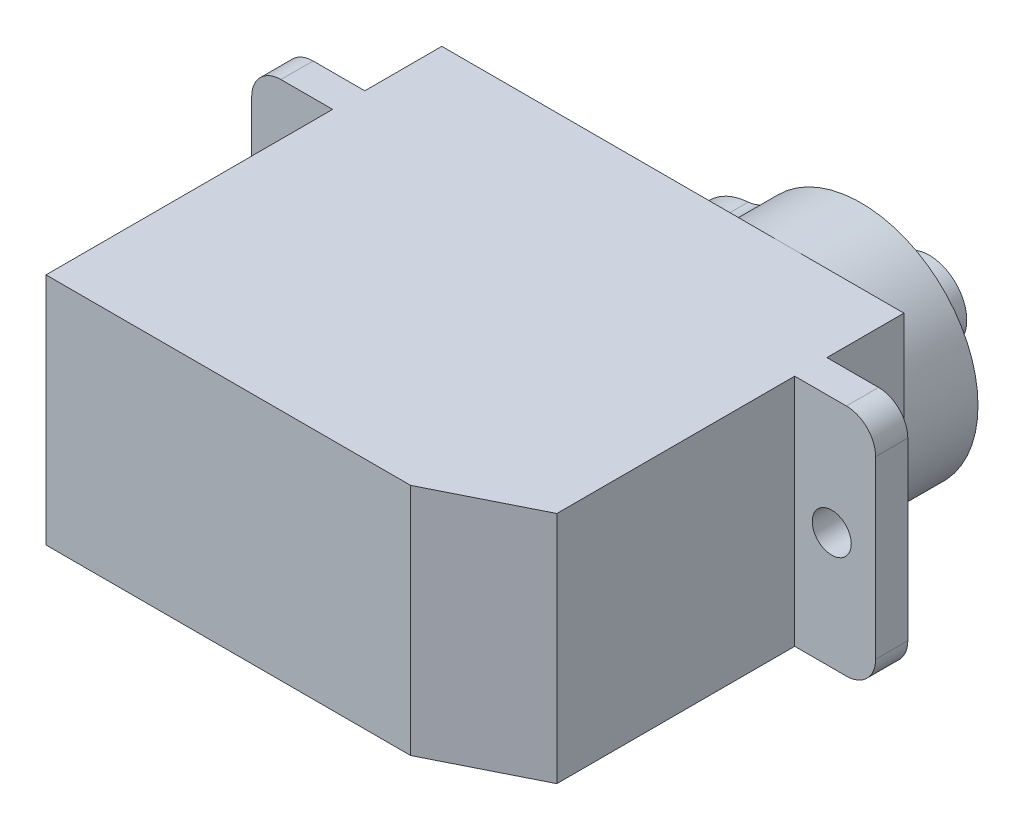
ISO-10303-21;
HEADER;
FILE_DESCRIPTION(('STEP AP214'),'2;1');
FILE_NAME('part.step','',(''),(''),'','','');
FILE_SCHEMA(('AUTOMOTIVE_DESIGN { 1 0 10303 214 1 1 1 1 }'));
ENDSEC;
DATA;
#1=APPLICATION_CONTEXT('core data for automotive mechanical design processes');
#2=APPLICATION_PROTOCOL_DEFINITION('international standard','automotive_design',2000,#1);
#3=PRODUCT_CONTEXT('',#1,'mechanical');
#4=PRODUCT('Part','Part','',(#3));
#5=PRODUCT_RELATED_PRODUCT_CATEGORY('part','',(#4));
#6=PRODUCT_DEFINITION_FORMATION('','',#4);
#7=PRODUCT_DEFINITION_CONTEXT('part definition',#1,'design');
#8=PRODUCT_DEFINITION('design','',#6,#7);
#9=PRODUCT_DEFINITION_SHAPE('','',#8);
#10=(LENGTH_UNIT() NAMED_UNIT(*) SI_UNIT(.MILLI.,.METRE.));
#11=(NAMED_UNIT(*) PLANE_ANGLE_UNIT() SI_UNIT($,.RADIAN.));
#12=(NAMED_UNIT(*) SI_UNIT($,.STERADIAN.) SOLID_ANGLE_UNIT());
#13=UNCERTAINTY_MEASURE_WITH_UNIT(LENGTH_MEASURE(1.E-05),#10,'distance_accuracy_value','');
#14=(GEOMETRIC_REPRESENTATION_CONTEXT(3) GLOBAL_UNCERTAINTY_ASSIGNED_CONTEXT((#13)) GLOBAL_UNIT_ASSIGNED_CONTEXT((#10,
#11,#12)) REPRESENTATION_CONTEXT('',''));
#15=CARTESIAN_POINT('',(0.,0.,0.));
#16=DIRECTION('',(0.,0.,1.));
#17=DIRECTION('',(1.,0.,0.));
#18=AXIS2_PLACEMENT_3D('',#15,#16,#17);
#19=CARTESIAN_POINT('',(5.85,0.,-17.45));
#20=DIRECTION('',(0.,0.,1.));
#21=DIRECTION('',(1.,0.,0.));
#22=AXIS2_PLACEMENT_3D('',#19,#20,#21);
#23=CYLINDRICAL_SURFACE('',#22,1.925);
#24=CARTESIAN_POINT('',(5.85,0.,-14.45));
#25=DIRECTION('',(0.,0.,-1.));
#26=DIRECTION('',(-1.,0.,0.));
#27=AXIS2_PLACEMENT_3D('',#24,#25,#26);
#28=CIRCLE('',#27,1.925);
#29=CARTESIAN_POINT('',(3.925,0.,-14.45));
#30=VERTEX_POINT('',#29);
#31=EDGE_CURVE('E251',#30,#30,#28,.T.);
#32=ORIENTED_EDGE('',*,*,#31,.T.);
#33=EDGE_LOOP('',(#32));
#34=FACE_BOUND('',#33,.T.);
#35=CARTESIAN_POINT('',(5.85,0.,-14.4853621479877));
#36=DIRECTION('',(0.,0.,-1.));
#37=DIRECTION('',(-1.,0.,0.));
#38=AXIS2_PLACEMENT_3D('',#35,#36,#37);
#39=CIRCLE('',#38,1.925);
#40=CARTESIAN_POINT('',(3.925,0.,-14.4853621479877));
#41=VERTEX_POINT('',#40);
#42=EDGE_CURVE('E241',#41,#41,#39,.T.);
#43=ORIENTED_EDGE('',*,*,#42,.F.);
#44=EDGE_LOOP('',(#43));
#45=FACE_BOUND('',#44,.T.);
#46=ADVANCED_FACE('F50',(#34,#45),#23,.T.);
#47=CARTESIAN_POINT('',(0.,-6.,-10.15));
#48=DIRECTION('',(0.,0.,1.));
#49=DIRECTION('',(1.,0.,0.));
#50=AXIS2_PLACEMENT_3D('',#47,#48,#49);
#51=PLANE('',#50);
#52=DIRECTION('',(-1.,0.,0.));
#53=VECTOR('',#52,1.);
#54=CARTESIAN_POINT('',(-3.85,-5.,-10.15));
#55=LINE('',#54,#53);
#56=CARTESIAN_POINT('',(-3.85,-5.,-10.15));
#57=VERTEX_POINT('',#56);
#58=CARTESIAN_POINT('',(-9.85,-5.,-10.15));
#59=VERTEX_POINT('',#58);
#60=EDGE_CURVE('E275',#57,#59,#55,.T.);
#61=ORIENTED_EDGE('',*,*,#60,.F.);
#62=DIRECTION('',(0.,-1.,0.));
#63=VECTOR('',#62,1.);
#64=CARTESIAN_POINT('',(-3.85,5.,-10.15));
#65=LINE('',#64,#63);
#66=CARTESIAN_POINT('',(-3.85,5.,-10.15));
#67=VERTEX_POINT('',#66);
#68=EDGE_CURVE('E67',#67,#57,#65,.T.);
#69=ORIENTED_EDGE('',*,*,#68,.F.);
#70=DIRECTION('',(1.,0.,0.));
#71=VECTOR('',#70,1.);
#72=CARTESIAN_POINT('',(-3.85,5.,-10.15));
#73=LINE('',#72,#71);
#74=CARTESIAN_POINT('',(-9.85,5.,-10.15));
#75=VERTEX_POINT('',#74);
#76=EDGE_CURVE('E264',#75,#67,#73,.T.);
#77=ORIENTED_EDGE('',*,*,#76,.F.);
#78=DIRECTION('',(0.,1.,0.));
#79=VECTOR('',#78,1.);
#80=CARTESIAN_POINT('',(-9.85,5.,-10.15));
#81=LINE('',#80,#79);
#82=EDGE_CURVE('E278',#59,#75,#81,.T.);
#83=ORIENTED_EDGE('',*,*,#82,.F.);
#84=EDGE_LOOP('',(#61,#69,#77,#83));
#85=FACE_BOUND('',#84,.T.);
#86=CARTESIAN_POINT('',(0.299999999999995,0.,-10.15));
#87=DIRECTION('',(0.,0.,-1.));
#88=DIRECTION('',(-1.,0.,0.));
#89=AXIS2_PLACEMENT_3D('',#86,#87,#88);
#90=CIRCLE('',#89,3.15);
#91=CARTESIAN_POINT('',(0.0665649520488194,-3.14133858066717,-10.15));
#92=VERTEX_POINT('',#91);
#93=CARTESIAN_POINT('',(0.0665649520488197,3.14133858066717,-10.15));
#94=VERTEX_POINT('',#93);
#95=EDGE_CURVE('E294',#92,#94,#90,.T.);
#96=ORIENTED_EDGE('',*,*,#95,.F.);
#97=CARTESIAN_POINT('',(-0.0445945945945973,-4.63721409527058,-10.15));
#98=DIRECTION('',(0.,0.,1.));
#99=DIRECTION('',(1.,0.,0.));
#100=AXIS2_PLACEMENT_3D('',#97,#98,#99);
#101=CIRCLE('',#100,1.5);
#102=CARTESIAN_POINT('',(1.13432432432432,-3.70977127621647,-10.15));
#103=VERTEX_POINT('',#102);
#104=EDGE_CURVE('E455',#92,#103,#101,.F.);
#105=ORIENTED_EDGE('',*,*,#104,.T.);
#106=CARTESIAN_POINT('',(5.85,0.,-10.15));
#107=DIRECTION('',(0.,0.,-1.));
#108=DIRECTION('',(-1.,0.,0.));
#109=AXIS2_PLACEMENT_3D('',#106,#107,#108);
#110=CIRCLE('',#109,6.);
#111=CARTESIAN_POINT('',(5.85,-6.,-10.15));
#112=VERTEX_POINT('',#111);
#113=EDGE_CURVE('E300',#112,#103,#110,.T.);
#114=ORIENTED_EDGE('',*,*,#113,.F.);
#115=DIRECTION('',(1.,0.,0.));
#116=VECTOR('',#115,1.);
#117=CARTESIAN_POINT('',(0.,-6.,-10.15));
#118=LINE('',#117,#116);
#119=CARTESIAN_POINT('',(-11.85,-6.,-10.15));
#120=VERTEX_POINT('',#119);
#121=EDGE_CURVE('E373',#120,#112,#118,.T.);
#122=ORIENTED_EDGE('',*,*,#121,.F.);
#123=DIRECTION('',(0.,1.,0.));
#124=VECTOR('',#123,1.);
#125=CARTESIAN_POINT('',(-11.85,-6.,-10.15));
#126=LINE('',#125,#124);
#127=CARTESIAN_POINT('',(-11.85,6.,-10.15));
#128=VERTEX_POINT('',#127);
#129=EDGE_CURVE('E377',#120,#128,#126,.T.);
#130=ORIENTED_EDGE('',*,*,#129,.T.);
#131=DIRECTION('',(1.,0.,0.));
#132=VECTOR('',#131,1.);
#133=CARTESIAN_POINT('',(0.,6.,-10.15));
#134=LINE('',#133,#132);
#135=CARTESIAN_POINT('',(5.85,6.,-10.15));
#136=VERTEX_POINT('',#135);
#137=EDGE_CURVE('E341',#128,#136,#134,.T.);
#138=ORIENTED_EDGE('',*,*,#137,.T.);
#139=CARTESIAN_POINT('',(1.13432432432432,3.70977127621647,-10.15));
#140=VERTEX_POINT('',#139);
#141=EDGE_CURVE('E285',#140,#136,#110,.T.);
#142=ORIENTED_EDGE('',*,*,#141,.F.);
#143=CARTESIAN_POINT('',(-0.0445945945945969,4.63721409527059,-10.15));
#144=DIRECTION('',(0.,0.,1.));
#145=DIRECTION('',(1.,0.,0.));
#146=AXIS2_PLACEMENT_3D('',#143,#144,#145);
#147=CIRCLE('',#146,1.5);
#148=EDGE_CURVE('E453',#140,#94,#147,.F.);
#149=ORIENTED_EDGE('',*,*,#148,.T.);
#150=EDGE_LOOP('',(#96,#105,#114,#122,#130,#138,#142,#149));
#151=FACE_BOUND('',#150,.T.);
#152=ADVANCED_FACE('F476',(#85,#151),#51,.F.);
#153=CARTESIAN_POINT('',(11.85,0.,-10.15));
#154=VERTEX_POINT('',#153);
#155=EDGE_CURVE('E299',#136,#154,#110,.T.);
#156=ORIENTED_EDGE('',*,*,#155,.F.);
#157=CARTESIAN_POINT('',(11.85,6.,-10.15));
#158=VERTEX_POINT('',#157);
#159=EDGE_CURVE('E340',#136,#158,#134,.T.);
#160=ORIENTED_EDGE('',*,*,#159,.T.);
#161=DIRECTION('',(0.,1.,0.));
#162=VECTOR('',#161,1.);
#163=CARTESIAN_POINT('',(11.85,-6.,-10.15));
#164=LINE('',#163,#162);
#165=EDGE_CURVE('E383',#154,#158,#164,.T.);
#166=ORIENTED_EDGE('',*,*,#165,.F.);
#167=EDGE_LOOP('',(#156,#160,#166));
#168=FACE_BOUND('',#167,.T.);
#169=ADVANCED_FACE('F491',(#168),#51,.F.);
#170=CARTESIAN_POINT('',(-11.85,-6.,0.));
#171=DIRECTION('',(1.,0.,0.));
#172=DIRECTION('',(0.,0.,-1.));
#173=AXIS2_PLACEMENT_3D('',#170,#171,#172);
#174=PLANE('',#173);
#175=DIRECTION('',(0.,1.,0.));
#176=VECTOR('',#175,1.);
#177=CARTESIAN_POINT('',(-11.85,-6.,-6.2));
#178=LINE('',#177,#176);
#179=CARTESIAN_POINT('',(-11.85,-6.,-6.2));
#180=VERTEX_POINT('',#179);
#181=CARTESIAN_POINT('',(-11.85,6.,-6.2));
#182=VERTEX_POINT('',#181);
#183=EDGE_CURVE('E376',#180,#182,#178,.T.);
#184=ORIENTED_EDGE('',*,*,#183,.T.);
#185=DIRECTION('',(0.,0.,-1.));
#186=VECTOR('',#185,1.);
#187=CARTESIAN_POINT('',(-11.85,6.,0.));
#188=LINE('',#187,#186);
#189=EDGE_CURVE('E312',#182,#128,#188,.T.);
#190=ORIENTED_EDGE('',*,*,#189,.T.);
#191=ORIENTED_EDGE('',*,*,#129,.F.);
#192=DIRECTION('',(0.,0.,-1.));
#193=VECTOR('',#192,1.);
#194=CARTESIAN_POINT('',(-11.85,-6.,0.));
#195=LINE('',#194,#193);
#196=EDGE_CURVE('E344',#180,#120,#195,.T.);
#197=ORIENTED_EDGE('',*,*,#196,.F.);
#198=EDGE_LOOP('',(#184,#190,#191,#197));
#199=FACE_BOUND('',#198,.T.);
#200=ADVANCED_FACE('F501',(#199),#174,.F.);
#201=EDGE_CURVE('E485',#154,#112,#110,.T.);
#202=ORIENTED_EDGE('',*,*,#201,.F.);
#203=CARTESIAN_POINT('',(11.85,-6.,-10.15));
#204=VERTEX_POINT('',#203);
#205=EDGE_CURVE('E380',#204,#154,#164,.T.);
#206=ORIENTED_EDGE('',*,*,#205,.F.);
#207=EDGE_CURVE('E372',#112,#204,#118,.T.);
#208=ORIENTED_EDGE('',*,*,#207,.F.);
#209=EDGE_LOOP('',(#202,#206,#208));
#210=FACE_BOUND('',#209,.T.);
#211=ADVANCED_FACE('F568',(#210),#51,.F.);
#212=CARTESIAN_POINT('',(11.85,-6.,0.));
#213=DIRECTION('',(1.,0.,0.));
#214=DIRECTION('',(0.,0.,-1.));
#215=AXIS2_PLACEMENT_3D('',#212,#213,#214);
#216=PLANE('',#215);
#217=ORIENTED_EDGE('',*,*,#205,.T.);
#218=ORIENTED_EDGE('',*,*,#165,.T.);
#219=DIRECTION('',(0.,0.,-1.));
#220=VECTOR('',#219,1.);
#221=CARTESIAN_POINT('',(11.85,6.,0.));
#222=LINE('',#221,#220);
#223=CARTESIAN_POINT('',(11.85,6.,-6.2));
#224=VERTEX_POINT('',#223);
#225=EDGE_CURVE('E337',#224,#158,#222,.T.);
#226=ORIENTED_EDGE('',*,*,#225,.F.);
#227=DIRECTION('',(0.,1.,0.));
#228=VECTOR('',#227,1.);
#229=CARTESIAN_POINT('',(11.85,-6.,-6.2));
#230=LINE('',#229,#228);
#231=CARTESIAN_POINT('',(11.85,-6.,-6.2));
#232=VERTEX_POINT('',#231);
#233=EDGE_CURVE('E384',#232,#224,#230,.T.);
#234=ORIENTED_EDGE('',*,*,#233,.F.);
#235=DIRECTION('',(0.,0.,-1.));
#236=VECTOR('',#235,1.);
#237=CARTESIAN_POINT('',(11.85,-6.,0.));
#238=LINE('',#237,#236);
#239=EDGE_CURVE('E369',#232,#204,#238,.T.);
#240=ORIENTED_EDGE('',*,*,#239,.T.);
#241=EDGE_LOOP('',(#217,#218,#226,#234,#240));
#242=FACE_BOUND('',#241,.T.);
#243=ADVANCED_FACE('F566',(#242),#216,.T.);
#244=CARTESIAN_POINT('',(0.,-6.,-6.2));
#245=DIRECTION('',(0.,0.,1.));
#246=DIRECTION('',(1.,0.,0.));
#247=AXIS2_PLACEMENT_3D('',#244,#245,#246);
#248=PLANE('',#247);
#249=CARTESIAN_POINT('',(13.75,0.,-6.2));
#250=DIRECTION('',(0.,0.,-1.));
#251=DIRECTION('',(-1.,0.,0.));
#252=AXIS2_PLACEMENT_3D('',#249,#250,#251);
#253=CIRCLE('',#252,1.);
#254=CARTESIAN_POINT('',(12.75,0.,-6.2));
#255=VERTEX_POINT('',#254);
#256=EDGE_CURVE('E308',#255,#255,#253,.T.);
#257=ORIENTED_EDGE('',*,*,#256,.F.);
#258=EDGE_LOOP('',(#257));
#259=FACE_BOUND('',#258,.T.);
#260=DIRECTION('',(0.,1.,0.));
#261=VECTOR('',#260,1.);
#262=CARTESIAN_POINT('',(16.,-6.,-6.2));
#263=LINE('',#262,#261);
#264=CARTESIAN_POINT('',(16.,-4.5,-6.2));
#265=VERTEX_POINT('',#264);
#266=CARTESIAN_POINT('',(16.,4.5,-6.2));
#267=VERTEX_POINT('',#266);
#268=EDGE_CURVE('E386',#265,#267,#263,.T.);
#269=ORIENTED_EDGE('',*,*,#268,.F.);
#270=CARTESIAN_POINT('',(14.5,-4.5,-6.2));
#271=DIRECTION('',(0.,0.,1.));
#272=DIRECTION('',(1.,0.,0.));
#273=AXIS2_PLACEMENT_3D('',#270,#271,#272);
#274=CIRCLE('',#273,1.5);
#275=CARTESIAN_POINT('',(14.5,-6.,-6.2));
#276=VERTEX_POINT('',#275);
#277=EDGE_CURVE('E426',#265,#276,#274,.F.);
#278=ORIENTED_EDGE('',*,*,#277,.T.);
#279=DIRECTION('',(1.,0.,0.));
#280=VECTOR('',#279,1.);
#281=CARTESIAN_POINT('',(0.,-6.,-6.2));
#282=LINE('',#281,#280);
#283=EDGE_CURVE('E366',#232,#276,#282,.T.);
#284=ORIENTED_EDGE('',*,*,#283,.F.);
#285=ORIENTED_EDGE('',*,*,#233,.T.);
#286=DIRECTION('',(1.,0.,0.));
#287=VECTOR('',#286,1.);
#288=CARTESIAN_POINT('',(0.,6.,-6.2));
#289=LINE('',#288,#287);
#290=CARTESIAN_POINT('',(14.5,6.,-6.2));
#291=VERTEX_POINT('',#290);
#292=EDGE_CURVE('E334',#224,#291,#289,.T.);
#293=ORIENTED_EDGE('',*,*,#292,.T.);
#294=CARTESIAN_POINT('',(14.5,4.5,-6.2));
#295=DIRECTION('',(0.,0.,1.));
#296=DIRECTION('',(1.,0.,0.));
#297=AXIS2_PLACEMENT_3D('',#294,#295,#296);
#298=CIRCLE('',#297,1.5);
#299=EDGE_CURVE('E424',#291,#267,#298,.F.);
#300=ORIENTED_EDGE('',*,*,#299,.T.);
#301=EDGE_LOOP('',(#269,#278,#284,#285,#293,#300));
#302=FACE_BOUND('',#301,.T.);
#303=ADVANCED_FACE('F555',(#259,#302),#248,.F.);
#304=CARTESIAN_POINT('',(16.,-6.,0.));
#305=DIRECTION('',(-1.,0.,0.));
#306=DIRECTION('',(0.,0.,1.));
#307=AXIS2_PLACEMENT_3D('',#304,#305,#306);
#308=PLANE('',#307);
#309=DIRECTION('',(0.,1.,0.));
#310=VECTOR('',#309,1.);
#311=CARTESIAN_POINT('',(16.,-6.,-4.55));
#312=LINE('',#311,#310);
#313=CARTESIAN_POINT('',(16.,-4.5,-4.55));
#314=VERTEX_POINT('',#313);
#315=CARTESIAN_POINT('',(16.,4.5,-4.55));
#316=VERTEX_POINT('',#315);
#317=EDGE_CURVE('E389',#314,#316,#312,.T.);
#318=ORIENTED_EDGE('',*,*,#317,.F.);
#319=DIRECTION('',(0.,0.,1.));
#320=VECTOR('',#319,1.);
#321=CARTESIAN_POINT('',(16.,-4.5,0.));
#322=LINE('',#321,#320);
#323=EDGE_CURVE('E422',#314,#265,#322,.F.);
#324=ORIENTED_EDGE('',*,*,#323,.T.);
#325=ORIENTED_EDGE('',*,*,#268,.T.);
#326=DIRECTION('',(0.,0.,1.));
#327=VECTOR('',#326,1.);
#328=CARTESIAN_POINT('',(16.,4.5,-4.55));
#329=LINE('',#328,#327);
#330=EDGE_CURVE('E419',#267,#316,#329,.T.);
#331=ORIENTED_EDGE('',*,*,#330,.T.);
#332=EDGE_LOOP('',(#318,#324,#325,#331));
#333=FACE_BOUND('',#332,.T.);
#334=ADVANCED_FACE('F558',(#333),#308,.F.);
#335=CARTESIAN_POINT('',(0.,-6.,-4.55));
#336=DIRECTION('',(0.,0.,1.));
#337=DIRECTION('',(1.,0.,0.));
#338=AXIS2_PLACEMENT_3D('',#335,#336,#337);
#339=PLANE('',#338);
#340=CARTESIAN_POINT('',(13.75,0.,-4.55));
#341=DIRECTION('',(0.,0.,1.));
#342=DIRECTION('',(1.,0.,0.));
#343=AXIS2_PLACEMENT_3D('',#340,#341,#342);
#344=CIRCLE('',#343,1.);
#345=CARTESIAN_POINT('',(14.75,0.,-4.55));
#346=VERTEX_POINT('',#345);
#347=EDGE_CURVE('E311',#346,#346,#344,.T.);
#348=ORIENTED_EDGE('',*,*,#347,.F.);
#349=EDGE_LOOP('',(#348));
#350=FACE_BOUND('',#349,.T.);
#351=DIRECTION('',(1.,0.,0.));
#352=VECTOR('',#351,1.);
#353=CARTESIAN_POINT('',(0.,-6.,-4.55));
#354=LINE('',#353,#352);
#355=CARTESIAN_POINT('',(11.85,-6.,-4.55));
#356=VERTEX_POINT('',#355);
#357=CARTESIAN_POINT('',(14.5,-6.,-4.55));
#358=VERTEX_POINT('',#357);
#359=EDGE_CURVE('E363',#356,#358,#354,.T.);
#360=ORIENTED_EDGE('',*,*,#359,.T.);
#361=CARTESIAN_POINT('',(14.5,-4.5,-4.55));
#362=DIRECTION('',(0.,0.,1.));
#363=DIRECTION('',(1.,0.,0.));
#364=AXIS2_PLACEMENT_3D('',#361,#362,#363);
#365=CIRCLE('',#364,1.5);
#366=EDGE_CURVE('E417',#358,#314,#365,.T.);
#367=ORIENTED_EDGE('',*,*,#366,.T.);
#368=ORIENTED_EDGE('',*,*,#317,.T.);
#369=CARTESIAN_POINT('',(14.5,4.5,-4.55));
#370=DIRECTION('',(0.,0.,1.));
#371=DIRECTION('',(1.,0.,0.));
#372=AXIS2_PLACEMENT_3D('',#369,#370,#371);
#373=CIRCLE('',#372,1.5);
#374=CARTESIAN_POINT('',(14.5,6.,-4.55));
#375=VERTEX_POINT('',#374);
#376=EDGE_CURVE('E415',#316,#375,#373,.T.);
#377=ORIENTED_EDGE('',*,*,#376,.T.);
#378=DIRECTION('',(1.,0.,0.));
#379=VECTOR('',#378,1.);
#380=CARTESIAN_POINT('',(0.,6.,-4.55));
#381=LINE('',#380,#379);
#382=CARTESIAN_POINT('',(11.85,6.,-4.55));
#383=VERTEX_POINT('',#382);
#384=EDGE_CURVE('E331',#383,#375,#381,.T.);
#385=ORIENTED_EDGE('',*,*,#384,.F.);
#386=DIRECTION('',(0.,1.,0.));
#387=VECTOR('',#386,1.);
#388=CARTESIAN_POINT('',(11.85,-6.,-4.55));
#389=LINE('',#388,#387);
#390=EDGE_CURVE('E392',#356,#383,#389,.T.);
#391=ORIENTED_EDGE('',*,*,#390,.F.);
#392=EDGE_LOOP('',(#360,#367,#368,#377,#385,#391));
#393=FACE_BOUND('',#392,.T.);
#394=ADVANCED_FACE('F545',(#350,#393),#339,.T.);
#395=CARTESIAN_POINT('',(11.85,-6.,0.));
#396=DIRECTION('',(1.,0.,0.));
#397=DIRECTION('',(0.,0.,-1.));
#398=AXIS2_PLACEMENT_3D('',#395,#396,#397);
#399=PLANE('',#398);
#400=ORIENTED_EDGE('',*,*,#390,.T.);
#401=DIRECTION('',(0.,0.,-1.));
#402=VECTOR('',#401,1.);
#403=CARTESIAN_POINT('',(11.85,6.,0.));
#404=LINE('',#403,#402);
#405=CARTESIAN_POINT('',(11.85,6.,7.65));
#406=VERTEX_POINT('',#405);
#407=EDGE_CURVE('E328',#406,#383,#404,.T.);
#408=ORIENTED_EDGE('',*,*,#407,.F.);
#409=DIRECTION('',(0.,1.,0.));
#410=VECTOR('',#409,1.);
#411=CARTESIAN_POINT('',(11.85,-6.,7.65));
#412=LINE('',#411,#410);
#413=CARTESIAN_POINT('',(11.85,-6.,7.65));
#414=VERTEX_POINT('',#413);
#415=EDGE_CURVE('E394',#414,#406,#412,.T.);
#416=ORIENTED_EDGE('',*,*,#415,.F.);
#417=DIRECTION('',(0.,0.,-1.));
#418=VECTOR('',#417,1.);
#419=CARTESIAN_POINT('',(11.85,-6.,0.));
#420=LINE('',#419,#418);
#421=EDGE_CURVE('E360',#414,#356,#420,.T.);
#422=ORIENTED_EDGE('',*,*,#421,.T.);
#423=EDGE_LOOP('',(#400,#408,#416,#422));
#424=FACE_BOUND('',#423,.T.);
#425=ADVANCED_FACE('F541',(#424),#399,.T.);
#426=CARTESIAN_POINT('',(5.43,-6.,10.86));
#427=DIRECTION('',(0.447213595499958,0.,0.894427190999916));
#428=DIRECTION('',(0.894427190999916,0.,-0.447213595499958));
#429=AXIS2_PLACEMENT_3D('',#426,#427,#428);
#430=PLANE('',#429);
#431=ORIENTED_EDGE('',*,*,#415,.T.);
#432=DIRECTION('',(0.894427190999916,0.,-0.447213595499958));
#433=VECTOR('',#432,1.);
#434=CARTESIAN_POINT('',(5.43,6.,10.86));
#435=LINE('',#434,#433);
#436=CARTESIAN_POINT('',(6.84999999999999,6.,10.15));
#437=VERTEX_POINT('',#436);
#438=EDGE_CURVE('E325',#437,#406,#435,.T.);
#439=ORIENTED_EDGE('',*,*,#438,.F.);
#440=DIRECTION('',(0.,1.,0.));
#441=VECTOR('',#440,1.);
#442=CARTESIAN_POINT('',(6.84999999999999,-6.,10.15));
#443=LINE('',#442,#441);
#444=CARTESIAN_POINT('',(6.84999999999999,-6.,10.15));
#445=VERTEX_POINT('',#444);
#446=EDGE_CURVE('E396',#445,#437,#443,.T.);
#447=ORIENTED_EDGE('',*,*,#446,.F.);
#448=DIRECTION('',(0.894427190999916,0.,-0.447213595499958));
#449=VECTOR('',#448,1.);
#450=CARTESIAN_POINT('',(5.43,-6.,10.86));
#451=LINE('',#450,#449);
#452=EDGE_CURVE('E357',#445,#414,#451,.T.);
#453=ORIENTED_EDGE('',*,*,#452,.T.);
#454=EDGE_LOOP('',(#431,#439,#447,#453));
#455=FACE_BOUND('',#454,.T.);
#456=ADVANCED_FACE('F538',(#455),#430,.T.);
#457=CARTESIAN_POINT('',(0.,-6.,10.15));
#458=DIRECTION('',(0.,0.,1.));
#459=DIRECTION('',(1.,0.,0.));
#460=AXIS2_PLACEMENT_3D('',#457,#458,#459);
#461=PLANE('',#460);
#462=ORIENTED_EDGE('',*,*,#446,.T.);
#463=DIRECTION('',(1.,0.,0.));
#464=VECTOR('',#463,1.);
#465=CARTESIAN_POINT('',(0.,6.,10.15));
#466=LINE('',#465,#464);
#467=CARTESIAN_POINT('',(-11.85,6.,10.15));
#468=VERTEX_POINT('',#467);
#469=EDGE_CURVE('E322',#468,#437,#466,.T.);
#470=ORIENTED_EDGE('',*,*,#469,.F.);
#471=DIRECTION('',(0.,1.,0.));
#472=VECTOR('',#471,1.);
#473=CARTESIAN_POINT('',(-11.85,-6.,10.15));
#474=LINE('',#473,#472);
#475=CARTESIAN_POINT('',(-11.85,-6.,10.15));
#476=VERTEX_POINT('',#475);
#477=EDGE_CURVE('E398',#476,#468,#474,.T.);
#478=ORIENTED_EDGE('',*,*,#477,.F.);
#479=DIRECTION('',(1.,0.,0.));
#480=VECTOR('',#479,1.);
#481=CARTESIAN_POINT('',(0.,-6.,10.15));
#482=LINE('',#481,#480);
#483=EDGE_CURVE('E354',#476,#445,#482,.T.);
#484=ORIENTED_EDGE('',*,*,#483,.T.);
#485=EDGE_LOOP('',(#462,#470,#478,#484));
#486=FACE_BOUND('',#485,.T.);
#487=ADVANCED_FACE('F919',(#486),#461,.T.);
#488=CARTESIAN_POINT('',(-11.85,-6.,0.));
#489=DIRECTION('',(1.,0.,0.));
#490=DIRECTION('',(0.,0.,-1.));
#491=AXIS2_PLACEMENT_3D('',#488,#489,#490);
#492=PLANE('',#491);
#493=ORIENTED_EDGE('',*,*,#477,.T.);
#494=DIRECTION('',(0.,0.,-1.));
#495=VECTOR('',#494,1.);
#496=CARTESIAN_POINT('',(-11.85,6.,0.));
#497=LINE('',#496,#495);
#498=CARTESIAN_POINT('',(-11.85,6.,-4.55));
#499=VERTEX_POINT('',#498);
#500=EDGE_CURVE('E319',#468,#499,#497,.T.);
#501=ORIENTED_EDGE('',*,*,#500,.T.);
#502=DIRECTION('',(0.,1.,0.));
#503=VECTOR('',#502,1.);
#504=CARTESIAN_POINT('',(-11.85,-6.,-4.55));
#505=LINE('',#504,#503);
#506=CARTESIAN_POINT('',(-11.85,-6.,-4.55));
#507=VERTEX_POINT('',#506);
#508=EDGE_CURVE('E400',#507,#499,#505,.T.);
#509=ORIENTED_EDGE('',*,*,#508,.F.);
#510=DIRECTION('',(0.,0.,-1.));
#511=VECTOR('',#510,1.);
#512=CARTESIAN_POINT('',(-11.85,-6.,0.));
#513=LINE('',#512,#511);
#514=EDGE_CURVE('E351',#476,#507,#513,.T.);
#515=ORIENTED_EDGE('',*,*,#514,.F.);
#516=EDGE_LOOP('',(#493,#501,#509,#515));
#517=FACE_BOUND('',#516,.T.);
#518=ADVANCED_FACE('F531',(#517),#492,.F.);
#519=CARTESIAN_POINT('',(0.,-6.,-4.55));
#520=DIRECTION('',(0.,0.,1.));
#521=DIRECTION('',(1.,0.,0.));
#522=AXIS2_PLACEMENT_3D('',#519,#520,#521);
#523=PLANE('',#522);
#524=CARTESIAN_POINT('',(-13.75,0.,-4.55));
#525=DIRECTION('',(0.,0.,1.));
#526=DIRECTION('',(1.,0.,0.));
#527=AXIS2_PLACEMENT_3D('',#524,#525,#526);
#528=CIRCLE('',#527,1.);
#529=CARTESIAN_POINT('',(-12.75,0.,-4.55));
#530=VERTEX_POINT('',#529);
#531=EDGE_CURVE('E305',#530,#530,#528,.T.);
#532=ORIENTED_EDGE('',*,*,#531,.F.);
#533=EDGE_LOOP('',(#532));
#534=FACE_BOUND('',#533,.T.);
#535=DIRECTION('',(1.,0.,0.));
#536=VECTOR('',#535,1.);
#537=CARTESIAN_POINT('',(0.,6.,-4.55));
#538=LINE('',#537,#536);
#539=CARTESIAN_POINT('',(-14.5,6.,-4.55));
#540=VERTEX_POINT('',#539);
#541=EDGE_CURVE('E317',#540,#499,#538,.T.);
#542=ORIENTED_EDGE('',*,*,#541,.F.);
#543=CARTESIAN_POINT('',(-14.5,4.5,-4.55));
#544=DIRECTION('',(0.,0.,1.));
#545=DIRECTION('',(1.,0.,0.));
#546=AXIS2_PLACEMENT_3D('',#543,#544,#545);
#547=CIRCLE('',#546,1.5);
#548=CARTESIAN_POINT('',(-16.,4.5,-4.55));
#549=VERTEX_POINT('',#548);
#550=EDGE_CURVE('E435',#540,#549,#547,.T.);
#551=ORIENTED_EDGE('',*,*,#550,.T.);
#552=DIRECTION('',(0.,1.,0.));
#553=VECTOR('',#552,1.);
#554=CARTESIAN_POINT('',(-16.,-6.,-4.55));
#555=LINE('',#554,#553);
#556=CARTESIAN_POINT('',(-16.,-4.5,-4.55));
#557=VERTEX_POINT('',#556);
#558=EDGE_CURVE('E403',#557,#549,#555,.T.);
#559=ORIENTED_EDGE('',*,*,#558,.F.);
#560=CARTESIAN_POINT('',(-14.5,-4.5,-4.55));
#561=DIRECTION('',(0.,0.,1.));
#562=DIRECTION('',(1.,0.,0.));
#563=AXIS2_PLACEMENT_3D('',#560,#561,#562);
#564=CIRCLE('',#563,1.5);
#565=CARTESIAN_POINT('',(-14.5,-6.,-4.55));
#566=VERTEX_POINT('',#565);
#567=EDGE_CURVE('E433',#557,#566,#564,.T.);
#568=ORIENTED_EDGE('',*,*,#567,.T.);
#569=DIRECTION('',(1.,0.,0.));
#570=VECTOR('',#569,1.);
#571=CARTESIAN_POINT('',(0.,-6.,-4.55));
#572=LINE('',#571,#570);
#573=EDGE_CURVE('E349',#566,#507,#572,.T.);
#574=ORIENTED_EDGE('',*,*,#573,.T.);
#575=ORIENTED_EDGE('',*,*,#508,.T.);
#576=EDGE_LOOP('',(#542,#551,#559,#568,#574,#575));
#577=FACE_BOUND('',#576,.T.);
#578=ADVANCED_FACE('F513',(#534,#577),#523,.T.);
#579=CARTESIAN_POINT('',(-16.,-6.,0.));
#580=DIRECTION('',(-1.,0.,0.));
#581=DIRECTION('',(0.,0.,1.));
#582=AXIS2_PLACEMENT_3D('',#579,#580,#581);
#583=PLANE('',#582);
#584=ORIENTED_EDGE('',*,*,#558,.T.);
#585=DIRECTION('',(0.,0.,1.));
#586=VECTOR('',#585,1.);
#587=CARTESIAN_POINT('',(-16.,4.5,0.));
#588=LINE('',#587,#586);
#589=CARTESIAN_POINT('',(-16.,4.5,-6.2));
#590=VERTEX_POINT('',#589);
#591=EDGE_CURVE('E440',#549,#590,#588,.F.);
#592=ORIENTED_EDGE('',*,*,#591,.T.);
#593=DIRECTION('',(0.,1.,0.));
#594=VECTOR('',#593,1.);
#595=CARTESIAN_POINT('',(-16.,-6.,-6.2));
#596=LINE('',#595,#594);
#597=CARTESIAN_POINT('',(-16.,-4.5,-6.2));
#598=VERTEX_POINT('',#597);
#599=EDGE_CURVE('E406',#598,#590,#596,.T.);
#600=ORIENTED_EDGE('',*,*,#599,.F.);
#601=DIRECTION('',(0.,0.,1.));
#602=VECTOR('',#601,1.);
#603=CARTESIAN_POINT('',(-16.,-4.5,-4.55));
#604=LINE('',#603,#602);
#605=EDGE_CURVE('E437',#598,#557,#604,.T.);
#606=ORIENTED_EDGE('',*,*,#605,.T.);
#607=EDGE_LOOP('',(#584,#592,#600,#606));
#608=FACE_BOUND('',#607,.T.);
#609=ADVANCED_FACE('F515',(#608),#583,.T.);
#610=CARTESIAN_POINT('',(0.,-6.,-6.2));
#611=DIRECTION('',(0.,0.,1.));
#612=DIRECTION('',(1.,0.,0.));
#613=AXIS2_PLACEMENT_3D('',#610,#611,#612);
#614=PLANE('',#613);
#615=CARTESIAN_POINT('',(-13.75,0.,-6.2));
#616=DIRECTION('',(0.,0.,-1.));
#617=DIRECTION('',(-1.,0.,0.));
#618=AXIS2_PLACEMENT_3D('',#615,#616,#617);
#619=CIRCLE('',#618,1.);
#620=CARTESIAN_POINT('',(-14.75,0.,-6.2));
#621=VERTEX_POINT('',#620);
#622=EDGE_CURVE('E297',#621,#621,#619,.T.);
#623=ORIENTED_EDGE('',*,*,#622,.F.);
#624=EDGE_LOOP('',(#623));
#625=FACE_BOUND('',#624,.T.);
#626=ORIENTED_EDGE('',*,*,#599,.T.);
#627=CARTESIAN_POINT('',(-14.5,4.5,-6.2));
#628=DIRECTION('',(0.,0.,1.));
#629=DIRECTION('',(1.,0.,0.));
#630=AXIS2_PLACEMENT_3D('',#627,#628,#629);
#631=CIRCLE('',#630,1.5);
#632=CARTESIAN_POINT('',(-14.5,6.,-6.2));
#633=VERTEX_POINT('',#632);
#634=EDGE_CURVE('E444',#590,#633,#631,.F.);
#635=ORIENTED_EDGE('',*,*,#634,.T.);
#636=DIRECTION('',(1.,0.,0.));
#637=VECTOR('',#636,1.);
#638=CARTESIAN_POINT('',(0.,6.,-6.2));
#639=LINE('',#638,#637);
#640=EDGE_CURVE('E315',#633,#182,#639,.T.);
#641=ORIENTED_EDGE('',*,*,#640,.T.);
#642=ORIENTED_EDGE('',*,*,#183,.F.);
#643=DIRECTION('',(1.,0.,0.));
#644=VECTOR('',#643,1.);
#645=CARTESIAN_POINT('',(0.,-6.,-6.2));
#646=LINE('',#645,#644);
#647=CARTESIAN_POINT('',(-14.5,-6.,-6.2));
#648=VERTEX_POINT('',#647);
#649=EDGE_CURVE('E347',#648,#180,#646,.T.);
#650=ORIENTED_EDGE('',*,*,#649,.F.);
#651=CARTESIAN_POINT('',(-14.5,-4.5,-6.2));
#652=DIRECTION('',(0.,0.,1.));
#653=DIRECTION('',(1.,0.,0.));
#654=AXIS2_PLACEMENT_3D('',#651,#652,#653);
#655=CIRCLE('',#654,1.5);
#656=EDGE_CURVE('E442',#648,#598,#655,.F.);
#657=ORIENTED_EDGE('',*,*,#656,.T.);
#658=EDGE_LOOP('',(#626,#635,#641,#642,#650,#657));
#659=FACE_BOUND('',#658,.T.);
#660=ADVANCED_FACE('F569',(#625,#659),#614,.F.);
#661=CARTESIAN_POINT('',(0.,-6.,0.));
#662=DIRECTION('',(0.,1.,0.));
#663=DIRECTION('',(0.,0.,1.));
#664=AXIS2_PLACEMENT_3D('',#661,#662,#663);
#665=PLANE('',#664);
#666=ORIENTED_EDGE('',*,*,#283,.T.);
#667=DIRECTION('',(0.,0.,1.));
#668=VECTOR('',#667,1.);
#669=CARTESIAN_POINT('',(14.5,-6.,0.));
#670=LINE('',#669,#668);
#671=EDGE_CURVE('E412',#276,#358,#670,.T.);
#672=ORIENTED_EDGE('',*,*,#671,.T.);
#673=ORIENTED_EDGE('',*,*,#359,.F.);
#674=ORIENTED_EDGE('',*,*,#421,.F.);
#675=ORIENTED_EDGE('',*,*,#452,.F.);
#676=ORIENTED_EDGE('',*,*,#483,.F.);
#677=ORIENTED_EDGE('',*,*,#514,.T.);
#678=ORIENTED_EDGE('',*,*,#573,.F.);
#679=DIRECTION('',(0.,0.,1.));
#680=VECTOR('',#679,1.);
#681=CARTESIAN_POINT('',(-14.5,-6.,-6.2));
#682=LINE('',#681,#680);
#683=EDGE_CURVE('E379',#566,#648,#682,.F.);
#684=ORIENTED_EDGE('',*,*,#683,.T.);
#685=ORIENTED_EDGE('',*,*,#649,.T.);
#686=ORIENTED_EDGE('',*,*,#196,.T.);
#687=ORIENTED_EDGE('',*,*,#121,.T.);
#688=ORIENTED_EDGE('',*,*,#207,.T.);
#689=ORIENTED_EDGE('',*,*,#239,.F.);
#690=EDGE_LOOP('',(#666,#672,#673,#674,#675,#676,#677,#678,#684,#685,#686,#687,#688,#689));
#691=FACE_BOUND('',#690,.T.);
#692=ADVANCED_FACE('F524',(#691),#665,.F.);
#693=CARTESIAN_POINT('',(0.,6.,0.));
#694=DIRECTION('',(0.,1.,0.));
#695=DIRECTION('',(0.,0.,1.));
#696=AXIS2_PLACEMENT_3D('',#693,#694,#695);
#697=PLANE('',#696);
#698=ORIENTED_EDGE('',*,*,#384,.T.);
#699=DIRECTION('',(0.,0.,1.));
#700=VECTOR('',#699,1.);
#701=CARTESIAN_POINT('',(14.5,6.,-6.2));
#702=LINE('',#701,#700);
#703=EDGE_CURVE('E431',#375,#291,#702,.F.);
#704=ORIENTED_EDGE('',*,*,#703,.T.);
#705=ORIENTED_EDGE('',*,*,#292,.F.);
#706=ORIENTED_EDGE('',*,*,#225,.T.);
#707=ORIENTED_EDGE('',*,*,#159,.F.);
#708=ORIENTED_EDGE('',*,*,#137,.F.);
#709=ORIENTED_EDGE('',*,*,#189,.F.);
#710=ORIENTED_EDGE('',*,*,#640,.F.);
#711=DIRECTION('',(0.,0.,1.));
#712=VECTOR('',#711,1.);
#713=CARTESIAN_POINT('',(-14.5,6.,0.));
#714=LINE('',#713,#712);
#715=EDGE_CURVE('E428',#633,#540,#714,.T.);
#716=ORIENTED_EDGE('',*,*,#715,.T.);
#717=ORIENTED_EDGE('',*,*,#541,.T.);
#718=ORIENTED_EDGE('',*,*,#500,.F.);
#719=ORIENTED_EDGE('',*,*,#469,.T.);
#720=ORIENTED_EDGE('',*,*,#438,.T.);
#721=ORIENTED_EDGE('',*,*,#407,.T.);
#722=EDGE_LOOP('',(#698,#704,#705,#706,#707,#708,#709,#710,#716,#717,#718,#719,#720,#721));
#723=FACE_BOUND('',#722,.T.);
#724=ADVANCED_FACE('F494',(#723),#697,.T.);
#725=CARTESIAN_POINT('',(14.5,-4.5,0.));
#726=DIRECTION('',(0.,0.,1.));
#727=DIRECTION('',(1.,0.,0.));
#728=AXIS2_PLACEMENT_3D('',#725,#726,#727);
#729=CYLINDRICAL_SURFACE('',#728,1.5);
#730=ORIENTED_EDGE('',*,*,#277,.F.);
#731=ORIENTED_EDGE('',*,*,#323,.F.);
#732=ORIENTED_EDGE('',*,*,#366,.F.);
#733=ORIENTED_EDGE('',*,*,#671,.F.);
#734=EDGE_LOOP('',(#730,#731,#732,#733));
#735=FACE_BOUND('',#734,.T.);
#736=ADVANCED_FACE('F561',(#735),#729,.T.);
#737=CARTESIAN_POINT('',(14.5,4.5,0.));
#738=DIRECTION('',(0.,0.,-1.));
#739=DIRECTION('',(-1.,0.,0.));
#740=AXIS2_PLACEMENT_3D('',#737,#738,#739);
#741=CYLINDRICAL_SURFACE('',#740,1.5);
#742=ORIENTED_EDGE('',*,*,#299,.F.);
#743=ORIENTED_EDGE('',*,*,#703,.F.);
#744=ORIENTED_EDGE('',*,*,#376,.F.);
#745=ORIENTED_EDGE('',*,*,#330,.F.);
#746=EDGE_LOOP('',(#742,#743,#744,#745));
#747=FACE_BOUND('',#746,.T.);
#748=ADVANCED_FACE('F551',(#747),#741,.T.);
#749=CARTESIAN_POINT('',(-14.5,4.5,0.));
#750=DIRECTION('',(0.,0.,1.));
#751=DIRECTION('',(1.,0.,0.));
#752=AXIS2_PLACEMENT_3D('',#749,#750,#751);
#753=CYLINDRICAL_SURFACE('',#752,1.5);
#754=ORIENTED_EDGE('',*,*,#634,.F.);
#755=ORIENTED_EDGE('',*,*,#591,.F.);
#756=ORIENTED_EDGE('',*,*,#550,.F.);
#757=ORIENTED_EDGE('',*,*,#715,.F.);
#758=EDGE_LOOP('',(#754,#755,#756,#757));
#759=FACE_BOUND('',#758,.T.);
#760=ADVANCED_FACE('F509',(#759),#753,.T.);
#761=CARTESIAN_POINT('',(-14.5,-4.5,0.));
#762=DIRECTION('',(0.,0.,-1.));
#763=DIRECTION('',(-1.,0.,0.));
#764=AXIS2_PLACEMENT_3D('',#761,#762,#763);
#765=CYLINDRICAL_SURFACE('',#764,1.5);
#766=ORIENTED_EDGE('',*,*,#656,.F.);
#767=ORIENTED_EDGE('',*,*,#683,.F.);
#768=ORIENTED_EDGE('',*,*,#567,.F.);
#769=ORIENTED_EDGE('',*,*,#605,.F.);
#770=EDGE_LOOP('',(#766,#767,#768,#769));
#771=FACE_BOUND('',#770,.T.);
#772=ADVANCED_FACE('F520',(#771),#765,.T.);
#773=CARTESIAN_POINT('',(13.75,0.,10.15));
#774=DIRECTION('',(0.,0.,-1.));
#775=DIRECTION('',(-1.,0.,0.));
#776=AXIS2_PLACEMENT_3D('',#773,#774,#775);
#777=CYLINDRICAL_SURFACE('',#776,1.);
#778=ORIENTED_EDGE('',*,*,#347,.T.);
#779=EDGE_LOOP('',(#778));
#780=FACE_BOUND('',#779,.T.);
#781=ORIENTED_EDGE('',*,*,#256,.T.);
#782=EDGE_LOOP('',(#781));
#783=FACE_BOUND('',#782,.T.);
#784=ADVANCED_FACE('F824',(#780,#783),#777,.F.);
#785=CARTESIAN_POINT('',(-13.75,0.,10.15));
#786=DIRECTION('',(0.,0.,-1.));
#787=DIRECTION('',(-1.,0.,0.));
#788=AXIS2_PLACEMENT_3D('',#785,#786,#787);
#789=CYLINDRICAL_SURFACE('',#788,1.);
#790=ORIENTED_EDGE('',*,*,#531,.T.);
#791=EDGE_LOOP('',(#790));
#792=FACE_BOUND('',#791,.T.);
#793=ORIENTED_EDGE('',*,*,#622,.T.);
#794=EDGE_LOOP('',(#793));
#795=FACE_BOUND('',#794,.T.);
#796=ADVANCED_FACE('F772',(#792,#795),#789,.F.);
#797=CARTESIAN_POINT('',(5.85,0.,-13.95));
#798=DIRECTION('',(0.,0.,1.));
#799=DIRECTION('',(1.,0.,0.));
#800=AXIS2_PLACEMENT_3D('',#797,#798,#799);
#801=CYLINDRICAL_SURFACE('',#800,6.);
#802=ORIENTED_EDGE('',*,*,#113,.T.);
#803=DIRECTION('',(0.,0.,1.));
#804=VECTOR('',#803,1.);
#805=CARTESIAN_POINT('',(1.13432432432432,-3.70977127621647,-13.95));
#806=LINE('',#805,#804);
#807=CARTESIAN_POINT('',(1.13432432432432,-3.70977127621647,-13.95));
#808=VERTEX_POINT('',#807);
#809=EDGE_CURVE('E75',#103,#808,#806,.F.);
#810=ORIENTED_EDGE('',*,*,#809,.T.);
#811=CARTESIAN_POINT('',(5.85,0.,-13.95));
#812=DIRECTION('',(0.,0.,-1.));
#813=DIRECTION('',(-1.,0.,0.));
#814=AXIS2_PLACEMENT_3D('',#811,#812,#813);
#815=CIRCLE('',#814,6.);
#816=CARTESIAN_POINT('',(1.13432432432432,3.70977127621647,-13.95));
#817=VERTEX_POINT('',#816);
#818=EDGE_CURVE('E291',#817,#808,#815,.T.);
#819=ORIENTED_EDGE('',*,*,#818,.F.);
#820=DIRECTION('',(0.,0.,1.));
#821=VECTOR('',#820,1.);
#822=CARTESIAN_POINT('',(1.13432432432432,3.70977127621647,-13.95));
#823=LINE('',#822,#821);
#824=EDGE_CURVE('E457',#817,#140,#823,.T.);
#825=ORIENTED_EDGE('',*,*,#824,.T.);
#826=ORIENTED_EDGE('',*,*,#141,.T.);
#827=ORIENTED_EDGE('',*,*,#155,.T.);
#828=ORIENTED_EDGE('',*,*,#201,.T.);
#829=EDGE_LOOP('',(#802,#810,#819,#825,#826,#827,#828));
#830=FACE_BOUND('',#829,.T.);
#831=ADVANCED_FACE('F471',(#830),#801,.T.);
#832=CARTESIAN_POINT('',(0.299999999999995,0.,-13.95));
#833=DIRECTION('',(0.,0.,1.));
#834=DIRECTION('',(1.,0.,0.));
#835=AXIS2_PLACEMENT_3D('',#832,#833,#834);
#836=CYLINDRICAL_SURFACE('',#835,3.15);
#837=CARTESIAN_POINT('',(0.299999999999995,0.,-13.95));
#838=DIRECTION('',(0.,0.,-1.));
#839=DIRECTION('',(-1.,0.,0.));
#840=AXIS2_PLACEMENT_3D('',#837,#838,#839);
#841=CIRCLE('',#840,3.15);
#842=CARTESIAN_POINT('',(0.0665649520488194,-3.14133858066717,-13.95));
#843=VERTEX_POINT('',#842);
#844=CARTESIAN_POINT('',(0.0665649520488197,3.14133858066717,-13.95));
#845=VERTEX_POINT('',#844);
#846=EDGE_CURVE('E293',#843,#845,#841,.T.);
#847=ORIENTED_EDGE('',*,*,#846,.F.);
#848=DIRECTION('',(0.,0.,1.));
#849=VECTOR('',#848,1.);
#850=CARTESIAN_POINT('',(0.0665649520488195,-3.14133858066717,-13.95));
#851=LINE('',#850,#849);
#852=EDGE_CURVE('E450',#843,#92,#851,.T.);
#853=ORIENTED_EDGE('',*,*,#852,.T.);
#854=ORIENTED_EDGE('',*,*,#95,.T.);
#855=DIRECTION('',(0.,0.,1.));
#856=VECTOR('',#855,1.);
#857=CARTESIAN_POINT('',(0.0665649520488198,3.14133858066717,-13.95));
#858=LINE('',#857,#856);
#859=EDGE_CURVE('E448',#94,#845,#858,.F.);
#860=ORIENTED_EDGE('',*,*,#859,.T.);
#861=EDGE_LOOP('',(#847,#853,#854,#860));
#862=FACE_BOUND('',#861,.T.);
#863=ADVANCED_FACE('F478',(#862),#836,.T.);
#864=CARTESIAN_POINT('',(0.,0.,-13.95));
#865=DIRECTION('',(0.,0.,-1.));
#866=DIRECTION('',(-1.,0.,0.));
#867=AXIS2_PLACEMENT_3D('',#864,#865,#866);
#868=PLANE('',#867);
#869=CARTESIAN_POINT('',(5.85,0.,-13.95));
#870=DIRECTION('',(0.,0.,-1.));
#871=DIRECTION('',(-1.,0.,0.));
#872=AXIS2_PLACEMENT_3D('',#869,#870,#871);
#873=CIRCLE('',#872,2.425);
#874=CARTESIAN_POINT('',(3.425,0.,-13.95));
#875=VERTEX_POINT('',#874);
#876=EDGE_CURVE('E13',#875,#875,#873,.F.);
#877=ORIENTED_EDGE('',*,*,#876,.T.);
#878=EDGE_LOOP('',(#877));
#879=FACE_BOUND('',#878,.T.);
#880=CARTESIAN_POINT('',(0.,0.,-13.95));
#881=DIRECTION('',(0.,0.,-1.));
#882=DIRECTION('',(-1.,0.,0.));
#883=AXIS2_PLACEMENT_3D('',#880,#881,#882);
#884=CIRCLE('',#883,1.);
#885=CARTESIAN_POINT('',(-1.,0.,-13.95));
#886=VERTEX_POINT('',#885);
#887=EDGE_CURVE('E254',#886,#886,#884,.T.);
#888=ORIENTED_EDGE('',*,*,#887,.F.);
#889=EDGE_LOOP('',(#888));
#890=FACE_BOUND('',#889,.T.);
#891=ORIENTED_EDGE('',*,*,#846,.T.);
#892=CARTESIAN_POINT('',(-0.0445945945945969,4.63721409527059,-13.95));
#893=DIRECTION('',(0.,0.,-1.));
#894=DIRECTION('',(-1.,0.,0.));
#895=AXIS2_PLACEMENT_3D('',#892,#893,#894);
#896=CIRCLE('',#895,1.5);
#897=EDGE_CURVE('E59',#845,#817,#896,.F.);
#898=ORIENTED_EDGE('',*,*,#897,.T.);
#899=ORIENTED_EDGE('',*,*,#818,.T.);
#900=CARTESIAN_POINT('',(-0.0445945945945973,-4.63721409527058,-13.95));
#901=DIRECTION('',(0.,0.,-1.));
#902=DIRECTION('',(-1.,0.,0.));
#903=AXIS2_PLACEMENT_3D('',#900,#901,#902);
#904=CIRCLE('',#903,1.5);
#905=EDGE_CURVE('E461',#808,#843,#904,.F.);
#906=ORIENTED_EDGE('',*,*,#905,.T.);
#907=EDGE_LOOP('',(#891,#898,#899,#906));
#908=FACE_BOUND('',#907,.T.);
#909=ADVANCED_FACE('F465',(#879,#890,#908),#868,.T.);
#910=CARTESIAN_POINT('',(-0.0445945945945973,-4.63721409527058,-13.95));
#911=DIRECTION('',(0.,0.,-1.));
#912=DIRECTION('',(-1.,0.,0.));
#913=AXIS2_PLACEMENT_3D('',#910,#911,#912);
#914=CYLINDRICAL_SURFACE('',#913,1.5);
#915=ORIENTED_EDGE('',*,*,#905,.F.);
#916=ORIENTED_EDGE('',*,*,#809,.F.);
#917=ORIENTED_EDGE('',*,*,#104,.F.);
#918=ORIENTED_EDGE('',*,*,#852,.F.);
#919=EDGE_LOOP('',(#915,#916,#917,#918));
#920=FACE_BOUND('',#919,.T.);
#921=ADVANCED_FACE('F481',(#920),#914,.F.);
#922=CARTESIAN_POINT('',(-0.0445945945945969,4.63721409527059,-13.95));
#923=DIRECTION('',(0.,0.,-1.));
#924=DIRECTION('',(-1.,0.,0.));
#925=AXIS2_PLACEMENT_3D('',#922,#923,#924);
#926=CYLINDRICAL_SURFACE('',#925,1.5);
#927=ORIENTED_EDGE('',*,*,#897,.F.);
#928=ORIENTED_EDGE('',*,*,#859,.F.);
#929=ORIENTED_EDGE('',*,*,#148,.F.);
#930=ORIENTED_EDGE('',*,*,#824,.F.);
#931=EDGE_LOOP('',(#927,#928,#929,#930));
#932=FACE_BOUND('',#931,.T.);
#933=ADVANCED_FACE('F473',(#932),#926,.F.);
#934=CARTESIAN_POINT('',(-3.85,5.,-9.95));
#935=DIRECTION('',(1.,0.,0.));
#936=DIRECTION('',(0.,0.,-1.));
#937=AXIS2_PLACEMENT_3D('',#934,#935,#936);
#938=PLANE('',#937);
#939=ORIENTED_EDGE('',*,*,#68,.T.);
#940=DIRECTION('',(0.,0.,-1.));
#941=VECTOR('',#940,1.);
#942=CARTESIAN_POINT('',(-3.85,-5.,-9.95));
#943=LINE('',#942,#941);
#944=CARTESIAN_POINT('',(-3.85,-5.,-9.95));
#945=VERTEX_POINT('',#944);
#946=EDGE_CURVE('E273',#945,#57,#943,.T.);
#947=ORIENTED_EDGE('',*,*,#946,.F.);
#948=DIRECTION('',(0.,-1.,0.));
#949=VECTOR('',#948,1.);
#950=CARTESIAN_POINT('',(-3.85,5.,-9.95));
#951=LINE('',#950,#949);
#952=CARTESIAN_POINT('',(-3.85,5.,-9.95));
#953=VERTEX_POINT('',#952);
#954=EDGE_CURVE('E260',#953,#945,#951,.T.);
#955=ORIENTED_EDGE('',*,*,#954,.F.);
#956=DIRECTION('',(0.,0.,-1.));
#957=VECTOR('',#956,1.);
#958=CARTESIAN_POINT('',(-3.85,5.,-9.95));
#959=LINE('',#958,#957);
#960=EDGE_CURVE('E283',#953,#67,#959,.T.);
#961=ORIENTED_EDGE('',*,*,#960,.T.);
#962=EDGE_LOOP('',(#939,#947,#955,#961));
#963=FACE_BOUND('',#962,.T.);
#964=ADVANCED_FACE('F725',(#963),#938,.F.);
#965=CARTESIAN_POINT('',(-3.85,5.,-9.95));
#966=DIRECTION('',(0.,1.,0.));
#967=DIRECTION('',(0.,0.,1.));
#968=AXIS2_PLACEMENT_3D('',#965,#966,#967);
#969=PLANE('',#968);
#970=ORIENTED_EDGE('',*,*,#76,.T.);
#971=ORIENTED_EDGE('',*,*,#960,.F.);
#972=DIRECTION('',(1.,0.,0.));
#973=VECTOR('',#972,1.);
#974=CARTESIAN_POINT('',(-3.85,5.,-9.95));
#975=LINE('',#974,#973);
#976=CARTESIAN_POINT('',(-9.85,5.,-9.95));
#977=VERTEX_POINT('',#976);
#978=EDGE_CURVE('E270',#977,#953,#975,.T.);
#979=ORIENTED_EDGE('',*,*,#978,.F.);
#980=DIRECTION('',(0.,0.,-1.));
#981=VECTOR('',#980,1.);
#982=CARTESIAN_POINT('',(-9.85,5.,-9.95));
#983=LINE('',#982,#981);
#984=EDGE_CURVE('E286',#977,#75,#983,.T.);
#985=ORIENTED_EDGE('',*,*,#984,.T.);
#986=EDGE_LOOP('',(#970,#971,#979,#985));
#987=FACE_BOUND('',#986,.T.);
#988=ADVANCED_FACE('F715',(#987),#969,.F.);
#989=CARTESIAN_POINT('',(-9.85,5.,-9.95));
#990=DIRECTION('',(-1.,0.,0.));
#991=DIRECTION('',(0.,0.,1.));
#992=AXIS2_PLACEMENT_3D('',#989,#990,#991);
#993=PLANE('',#992);
#994=ORIENTED_EDGE('',*,*,#82,.T.);
#995=ORIENTED_EDGE('',*,*,#984,.F.);
#996=DIRECTION('',(0.,1.,0.));
#997=VECTOR('',#996,1.);
#998=CARTESIAN_POINT('',(-9.85,5.,-9.95));
#999=LINE('',#998,#997);
#1000=CARTESIAN_POINT('',(-9.85,-5.,-9.95));
#1001=VERTEX_POINT('',#1000);
#1002=EDGE_CURVE('E267',#1001,#977,#999,.T.);
#1003=ORIENTED_EDGE('',*,*,#1002,.F.);
#1004=DIRECTION('',(0.,0.,-1.));
#1005=VECTOR('',#1004,1.);
#1006=CARTESIAN_POINT('',(-9.85,-5.,-9.95));
#1007=LINE('',#1006,#1005);
#1008=EDGE_CURVE('E288',#1001,#59,#1007,.T.);
#1009=ORIENTED_EDGE('',*,*,#1008,.T.);
#1010=EDGE_LOOP('',(#994,#995,#1003,#1009));
#1011=FACE_BOUND('',#1010,.T.);
#1012=ADVANCED_FACE('F705',(#1011),#993,.F.);
#1013=CARTESIAN_POINT('',(-3.85,-5.,-9.95));
#1014=DIRECTION('',(0.,-1.,0.));
#1015=DIRECTION('',(0.,0.,-1.));
#1016=AXIS2_PLACEMENT_3D('',#1013,#1014,#1015);
#1017=PLANE('',#1016);
#1018=ORIENTED_EDGE('',*,*,#60,.T.);
#1019=ORIENTED_EDGE('',*,*,#1008,.F.);
#1020=DIRECTION('',(-1.,0.,0.));
#1021=VECTOR('',#1020,1.);
#1022=CARTESIAN_POINT('',(-3.85,-5.,-9.95));
#1023=LINE('',#1022,#1021);
#1024=EDGE_CURVE('E263',#945,#1001,#1023,.T.);
#1025=ORIENTED_EDGE('',*,*,#1024,.F.);
#1026=ORIENTED_EDGE('',*,*,#946,.T.);
#1027=EDGE_LOOP('',(#1018,#1019,#1025,#1026));
#1028=FACE_BOUND('',#1027,.T.);
#1029=ADVANCED_FACE('F695',(#1028),#1017,.F.);
#1030=CARTESIAN_POINT('',(0.,0.,-9.95));
#1031=DIRECTION('',(0.,0.,-1.));
#1032=DIRECTION('',(-1.,0.,0.));
#1033=AXIS2_PLACEMENT_3D('',#1030,#1031,#1032);
#1034=PLANE('',#1033);
#1035=ORIENTED_EDGE('',*,*,#954,.T.);
#1036=ORIENTED_EDGE('',*,*,#1024,.T.);
#1037=ORIENTED_EDGE('',*,*,#1002,.T.);
#1038=ORIENTED_EDGE('',*,*,#978,.T.);
#1039=EDGE_LOOP('',(#1035,#1036,#1037,#1038));
#1040=FACE_BOUND('',#1039,.T.);
#1041=ADVANCED_FACE('F685',(#1040),#1034,.T.);
#1042=CARTESIAN_POINT('',(0.,0.,-14.45));
#1043=DIRECTION('',(0.,0.,1.));
#1044=DIRECTION('',(1.,0.,0.));
#1045=AXIS2_PLACEMENT_3D('',#1042,#1043,#1044);
#1046=CYLINDRICAL_SURFACE('',#1045,1.);
#1047=CARTESIAN_POINT('',(0.,0.,-14.45));
#1048=DIRECTION('',(0.,0.,-1.));
#1049=DIRECTION('',(-1.,0.,0.));
#1050=AXIS2_PLACEMENT_3D('',#1047,#1048,#1049);
#1051=CIRCLE('',#1050,1.);
#1052=CARTESIAN_POINT('',(-1.,0.,-14.45));
#1053=VERTEX_POINT('',#1052);
#1054=EDGE_CURVE('E255',#1053,#1053,#1051,.T.);
#1055=ORIENTED_EDGE('',*,*,#1054,.F.);
#1056=EDGE_LOOP('',(#1055));
#1057=FACE_BOUND('',#1056,.T.);
#1058=ORIENTED_EDGE('',*,*,#887,.T.);
#1059=EDGE_LOOP('',(#1058));
#1060=FACE_BOUND('',#1059,.T.);
#1061=ADVANCED_FACE('F676',(#1057,#1060),#1046,.T.);
#1062=CARTESIAN_POINT('',(0.,0.,-14.45));
#1063=DIRECTION('',(0.,0.,-1.));
#1064=DIRECTION('',(-1.,0.,0.));
#1065=AXIS2_PLACEMENT_3D('',#1062,#1063,#1064);
#1066=PLANE('',#1065);
#1067=ORIENTED_EDGE('',*,*,#1054,.T.);
#1068=EDGE_LOOP('',(#1067));
#1069=FACE_BOUND('',#1068,.T.);
#1070=ADVANCED_FACE('F611',(#1069),#1066,.T.);
#1071=CARTESIAN_POINT('',(5.85,0.,-14.45));
#1072=DIRECTION('',(0.,0.,1.));
#1073=DIRECTION('',(1.,0.,0.));
#1074=AXIS2_PLACEMENT_3D('',#1071,#1072,#1073);
#1075=CONICAL_SURFACE('',#1074,1.925,0.785398163397445);
#1076=ORIENTED_EDGE('',*,*,#876,.F.);
#1077=EDGE_LOOP('',(#1076));
#1078=FACE_BOUND('',#1077,.T.);
#1079=ORIENTED_EDGE('',*,*,#31,.F.);
#1080=EDGE_LOOP('',(#1079));
#1081=FACE_BOUND('',#1080,.T.);
#1082=ADVANCED_FACE('F52',(#1078,#1081),#1075,.T.);
#1083=CARTESIAN_POINT('',(5.85,0.,-14.9183748498799));
#1084=DIRECTION('',(0.,0.,-1.));
#1085=DIRECTION('',(-1.,0.,0.));
#1086=AXIS2_PLACEMENT_3D('',#1083,#1084,#1085);
#1087=TOROIDAL_SURFACE('',#1086,2.175,0.500000000000001);
#1088=ORIENTED_EDGE('',*,*,#42,.T.);
#1089=EDGE_LOOP('',(#1088));
#1090=FACE_BOUND('',#1089,.T.);
#1091=CARTESIAN_POINT('',(5.85,0.,-15.3513875517721));
#1092=DIRECTION('',(0.,0.,1.));
#1093=DIRECTION('',(1.,0.,0.));
#1094=AXIS2_PLACEMENT_3D('',#1091,#1092,#1093);
#1095=CIRCLE('',#1094,1.925);
#1096=CARTESIAN_POINT('',(7.775,0.,-15.3513875517721));
#1097=VERTEX_POINT('',#1096);
#1098=EDGE_CURVE('E54',#1097,#1097,#1095,.T.);
#1099=ORIENTED_EDGE('',*,*,#1098,.T.);
#1100=EDGE_LOOP('',(#1099));
#1101=FACE_BOUND('',#1100,.T.);
#1102=ADVANCED_FACE('F598',(#1090,#1101),#1087,.F.);
#1103=CARTESIAN_POINT('',(5.85,0.,-17.45));
#1104=DIRECTION('',(0.,0.,-1.));
#1105=DIRECTION('',(-1.,0.,0.));
#1106=AXIS2_PLACEMENT_3D('',#1103,#1104,#1105);
#1107=PLANE('',#1106);
#1108=CARTESIAN_POINT('',(5.85,0.,-17.45));
#1109=DIRECTION('',(0.,0.,-1.));
#1110=DIRECTION('',(-1.,0.,0.));
#1111=AXIS2_PLACEMENT_3D('',#1108,#1109,#1110);
#1112=CIRCLE('',#1111,0.799999999999999);
#1113=CARTESIAN_POINT('',(5.05,0.,-17.45));
#1114=VERTEX_POINT('',#1113);
#1115=EDGE_CURVE('E242',#1114,#1114,#1112,.T.);
#1116=ORIENTED_EDGE('',*,*,#1115,.F.);
#1117=EDGE_LOOP('',(#1116));
#1118=FACE_BOUND('',#1117,.T.);
#1119=CARTESIAN_POINT('',(5.85,0.,-17.45));
#1120=DIRECTION('',(0.,0.,-1.));
#1121=DIRECTION('',(-1.,0.,0.));
#1122=AXIS2_PLACEMENT_3D('',#1119,#1120,#1121);
#1123=CIRCLE('',#1122,1.925);
#1124=CARTESIAN_POINT('',(3.925,0.,-17.45));
#1125=VERTEX_POINT('',#1124);
#1126=EDGE_CURVE('E248',#1125,#1125,#1123,.T.);
#1127=ORIENTED_EDGE('',*,*,#1126,.T.);
#1128=EDGE_LOOP('',(#1127));
#1129=FACE_BOUND('',#1128,.T.);
#1130=ADVANCED_FACE('F593',(#1118,#1129),#1107,.T.);
#1131=ORIENTED_EDGE('',*,*,#1126,.F.);
#1132=EDGE_LOOP('',(#1131));
#1133=FACE_BOUND('',#1132,.T.);
#1134=ORIENTED_EDGE('',*,*,#1098,.F.);
#1135=EDGE_LOOP('',(#1134));
#1136=FACE_BOUND('',#1135,.T.);
#1137=ADVANCED_FACE('F235',(#1133,#1136),#23,.T.);
#1138=CARTESIAN_POINT('',(5.85,0.,-12.25));
#1139=DIRECTION('',(0.,0.,-1.));
#1140=DIRECTION('',(-1.,0.,0.));
#1141=AXIS2_PLACEMENT_3D('',#1138,#1139,#1140);
#1142=CONICAL_SURFACE('',#1141,0.799999999999999,1.02974425867665);
#1143=CARTESIAN_POINT('',(5.85,0.,-11.7693115047779));
#1144=VERTEX_POINT('',#1143);
#1145=VERTEX_LOOP('',#1144);
#1146=FACE_BOUND('',#1145,.T.);
#1147=CARTESIAN_POINT('',(5.85,0.,-12.25));
#1148=DIRECTION('',(0.,0.,-1.));
#1149=DIRECTION('',(-1.,0.,0.));
#1150=AXIS2_PLACEMENT_3D('',#1147,#1148,#1149);
#1151=CIRCLE('',#1150,0.799999999999999);
#1152=CARTESIAN_POINT('',(5.05,0.,-12.25));
#1153=VERTEX_POINT('',#1152);
#1154=EDGE_CURVE('E239',#1153,#1153,#1151,.T.);
#1155=ORIENTED_EDGE('',*,*,#1154,.T.);
#1156=EDGE_LOOP('',(#1155));
#1157=FACE_BOUND('',#1156,.T.);
#1158=ADVANCED_FACE('F231',(#1146,#1157),#1142,.F.);
#1159=CARTESIAN_POINT('',(5.85,0.,-17.45));
#1160=DIRECTION('',(0.,0.,-1.));
#1161=DIRECTION('',(-1.,0.,0.));
#1162=AXIS2_PLACEMENT_3D('',#1159,#1160,#1161);
#1163=CYLINDRICAL_SURFACE('',#1162,0.799999999999999);
#1164=ORIENTED_EDGE('',*,*,#1154,.F.);
#1165=EDGE_LOOP('',(#1164));
#1166=FACE_BOUND('',#1165,.T.);
#1167=ORIENTED_EDGE('',*,*,#1115,.T.);
#1168=EDGE_LOOP('',(#1167));
#1169=FACE_BOUND('',#1168,.T.);
#1170=ADVANCED_FACE('F234',(#1166,#1169),#1163,.F.);
#1171=CLOSED_SHELL('',(#46,#152,#169,#200,#211,#243,#303,#334,#394,#425,#456,#487,#518,#578,
#609,#660,#692,#724,#736,#748,#760,#772,#784,#796,#831,#863,#909,#921,#933,#964,#988,#1012,
#1029,#1041,#1061,#1070,#1082,#1102,#1130,#1137,#1158,#1170));
#1172=MANIFOLD_SOLID_BREP('B2',#1171);
#1173=ADVANCED_BREP_SHAPE_REPRESENTATION('',(#18,#1172),#14);
#1174=SHAPE_DEFINITION_REPRESENTATION(#9,#1173);
ENDSEC;
END-ISO-10303-21;
